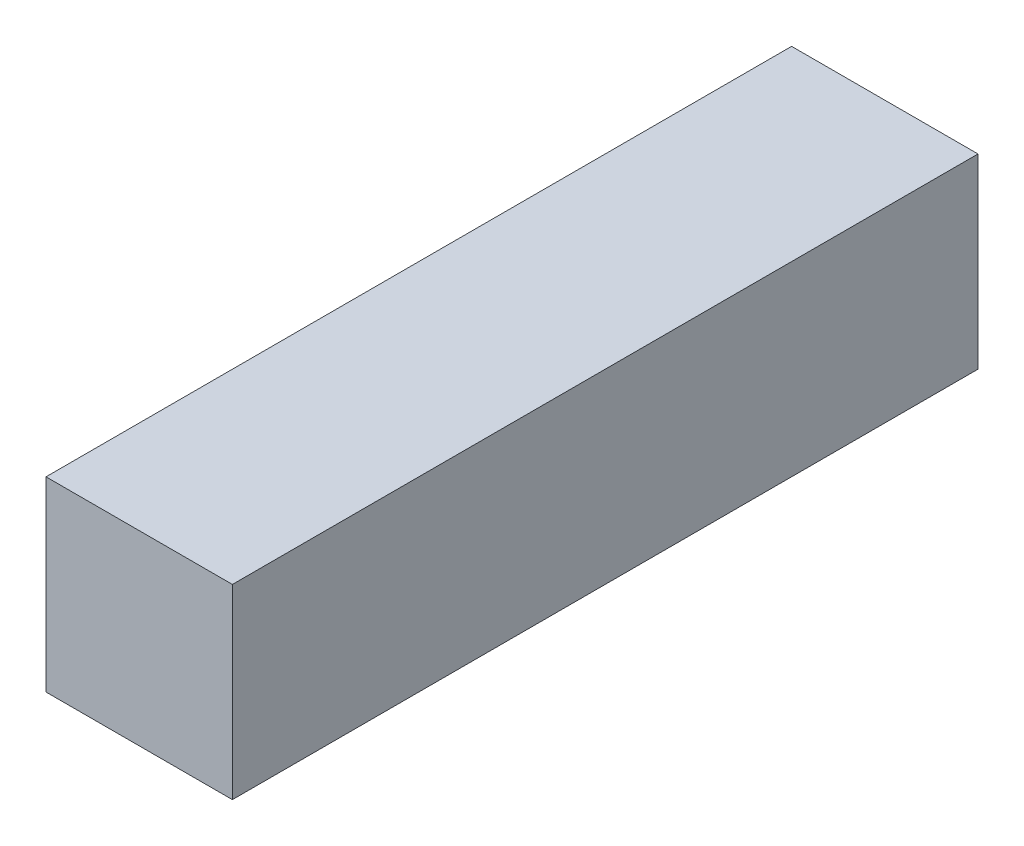
ISO-10303-21;
HEADER;
FILE_DESCRIPTION(('STEP AP214'),'2;1');
FILE_NAME('part.step','',(''),(''),'','','');
FILE_SCHEMA(('AUTOMOTIVE_DESIGN { 1 0 10303 214 1 1 1 1 }'));
ENDSEC;
DATA;
#1=APPLICATION_CONTEXT('core data for automotive mechanical design processes');
#2=APPLICATION_PROTOCOL_DEFINITION('international standard','automotive_design',2000,#1);
#3=PRODUCT_CONTEXT('',#1,'mechanical');
#4=PRODUCT('Part','Part','',(#3));
#5=PRODUCT_RELATED_PRODUCT_CATEGORY('part','',(#4));
#6=PRODUCT_DEFINITION_FORMATION('','',#4);
#7=PRODUCT_DEFINITION_CONTEXT('part definition',#1,'design');
#8=PRODUCT_DEFINITION('design','',#6,#7);
#9=PRODUCT_DEFINITION_SHAPE('','',#8);
#10=(LENGTH_UNIT() NAMED_UNIT(*) SI_UNIT(.MILLI.,.METRE.));
#11=(NAMED_UNIT(*) PLANE_ANGLE_UNIT() SI_UNIT($,.RADIAN.));
#12=(NAMED_UNIT(*) SI_UNIT($,.STERADIAN.) SOLID_ANGLE_UNIT());
#13=UNCERTAINTY_MEASURE_WITH_UNIT(LENGTH_MEASURE(1.E-05),#10,'distance_accuracy_value','');
#14=(GEOMETRIC_REPRESENTATION_CONTEXT(3) GLOBAL_UNCERTAINTY_ASSIGNED_CONTEXT((#13)) GLOBAL_UNIT_ASSIGNED_CONTEXT((#10,
#11,#12)) REPRESENTATION_CONTEXT('',''));
#15=CARTESIAN_POINT('',(0.,0.,0.));
#16=DIRECTION('',(0.,0.,1.));
#17=DIRECTION('',(1.,0.,0.));
#18=AXIS2_PLACEMENT_3D('',#15,#16,#17);
#19=CARTESIAN_POINT('',(-2.75,2.75,22.));
#20=DIRECTION('',(1.,0.,0.));
#21=DIRECTION('',(0.,1.,0.));
#22=AXIS2_PLACEMENT_3D('',#19,#20,#21);
#23=PLANE('',#22);
#24=DIRECTION('',(0.,-1.,0.));
#25=VECTOR('',#24,1.);
#26=CARTESIAN_POINT('',(-2.75,2.75,0.));
#27=LINE('',#26,#25);
#28=CARTESIAN_POINT('',(-2.75,2.75,0.));
#29=VERTEX_POINT('',#28);
#30=CARTESIAN_POINT('',(-2.75,-2.75,0.));
#31=VERTEX_POINT('',#30);
#32=EDGE_CURVE('E96',#29,#31,#27,.T.);
#33=ORIENTED_EDGE('',*,*,#32,.T.);
#34=DIRECTION('',(0.,0.,-1.));
#35=VECTOR('',#34,1.);
#36=CARTESIAN_POINT('',(-2.75,-2.75,22.));
#37=LINE('',#36,#35);
#38=CARTESIAN_POINT('',(-2.75,-2.75,22.));
#39=VERTEX_POINT('',#38);
#40=EDGE_CURVE('E11',#39,#31,#37,.T.);
#41=ORIENTED_EDGE('',*,*,#40,.F.);
#42=DIRECTION('',(0.,-1.,0.));
#43=VECTOR('',#42,1.);
#44=CARTESIAN_POINT('',(-2.75,2.75,22.));
#45=LINE('',#44,#43);
#46=CARTESIAN_POINT('',(-2.75,2.75,22.));
#47=VERTEX_POINT('',#46);
#48=EDGE_CURVE('E84',#47,#39,#45,.T.);
#49=ORIENTED_EDGE('',*,*,#48,.F.);
#50=DIRECTION('',(0.,0.,-1.));
#51=VECTOR('',#50,1.);
#52=CARTESIAN_POINT('',(-2.75,2.75,22.));
#53=LINE('',#52,#51);
#54=EDGE_CURVE('E92',#47,#29,#53,.T.);
#55=ORIENTED_EDGE('',*,*,#54,.T.);
#56=EDGE_LOOP('',(#33,#41,#49,#55));
#57=FACE_BOUND('',#56,.T.);
#58=ADVANCED_FACE('F33',(#57),#23,.F.);
#59=CARTESIAN_POINT('',(2.75,-2.75,22.));
#60=DIRECTION('',(0.,1.,0.));
#61=DIRECTION('',(-1.,0.,0.));
#62=AXIS2_PLACEMENT_3D('',#59,#60,#61);
#63=PLANE('',#62);
#64=DIRECTION('',(1.,0.,0.));
#65=VECTOR('',#64,1.);
#66=CARTESIAN_POINT('',(2.75,-2.75,0.));
#67=LINE('',#66,#65);
#68=CARTESIAN_POINT('',(2.75,-2.75,0.));
#69=VERTEX_POINT('',#68);
#70=EDGE_CURVE('E88',#31,#69,#67,.T.);
#71=ORIENTED_EDGE('',*,*,#70,.T.);
#72=DIRECTION('',(0.,0.,-1.));
#73=VECTOR('',#72,1.);
#74=CARTESIAN_POINT('',(2.75,-2.75,22.));
#75=LINE('',#74,#73);
#76=CARTESIAN_POINT('',(2.75,-2.75,22.));
#77=VERTEX_POINT('',#76);
#78=EDGE_CURVE('E41',#77,#69,#75,.T.);
#79=ORIENTED_EDGE('',*,*,#78,.F.);
#80=DIRECTION('',(1.,0.,0.));
#81=VECTOR('',#80,1.);
#82=CARTESIAN_POINT('',(2.75,-2.75,22.));
#83=LINE('',#82,#81);
#84=EDGE_CURVE('E79',#39,#77,#83,.T.);
#85=ORIENTED_EDGE('',*,*,#84,.F.);
#86=ORIENTED_EDGE('',*,*,#40,.T.);
#87=EDGE_LOOP('',(#71,#79,#85,#86));
#88=FACE_BOUND('',#87,.T.);
#89=ADVANCED_FACE('F87',(#88),#63,.F.);
#90=CARTESIAN_POINT('',(2.75,2.75,22.));
#91=DIRECTION('',(-1.,0.,0.));
#92=DIRECTION('',(0.,-1.,0.));
#93=AXIS2_PLACEMENT_3D('',#90,#91,#92);
#94=PLANE('',#93);
#95=DIRECTION('',(0.,1.,0.));
#96=VECTOR('',#95,1.);
#97=CARTESIAN_POINT('',(2.75,2.75,0.));
#98=LINE('',#97,#96);
#99=CARTESIAN_POINT('',(2.75,2.75,0.));
#100=VERTEX_POINT('',#99);
#101=EDGE_CURVE('E66',#69,#100,#98,.T.);
#102=ORIENTED_EDGE('',*,*,#101,.T.);
#103=DIRECTION('',(0.,0.,-1.));
#104=VECTOR('',#103,1.);
#105=CARTESIAN_POINT('',(2.75,2.75,22.));
#106=LINE('',#105,#104);
#107=CARTESIAN_POINT('',(2.75,2.75,22.));
#108=VERTEX_POINT('',#107);
#109=EDGE_CURVE('E89',#108,#100,#106,.T.);
#110=ORIENTED_EDGE('',*,*,#109,.F.);
#111=DIRECTION('',(0.,1.,0.));
#112=VECTOR('',#111,1.);
#113=CARTESIAN_POINT('',(2.75,2.75,22.));
#114=LINE('',#113,#112);
#115=EDGE_CURVE('E82',#77,#108,#114,.T.);
#116=ORIENTED_EDGE('',*,*,#115,.F.);
#117=ORIENTED_EDGE('',*,*,#78,.T.);
#118=EDGE_LOOP('',(#102,#110,#116,#117));
#119=FACE_BOUND('',#118,.T.);
#120=ADVANCED_FACE('F90',(#119),#94,.F.);
#121=CARTESIAN_POINT('',(2.75,2.75,22.));
#122=DIRECTION('',(0.,-1.,0.));
#123=DIRECTION('',(1.,0.,0.));
#124=AXIS2_PLACEMENT_3D('',#121,#122,#123);
#125=PLANE('',#124);
#126=DIRECTION('',(-1.,0.,0.));
#127=VECTOR('',#126,1.);
#128=CARTESIAN_POINT('',(2.75,2.75,0.));
#129=LINE('',#128,#127);
#130=EDGE_CURVE('E72',#100,#29,#129,.T.);
#131=ORIENTED_EDGE('',*,*,#130,.T.);
#132=ORIENTED_EDGE('',*,*,#54,.F.);
#133=DIRECTION('',(-1.,0.,0.));
#134=VECTOR('',#133,1.);
#135=CARTESIAN_POINT('',(2.75,2.75,22.));
#136=LINE('',#135,#134);
#137=EDGE_CURVE('E49',#108,#47,#136,.T.);
#138=ORIENTED_EDGE('',*,*,#137,.F.);
#139=ORIENTED_EDGE('',*,*,#109,.T.);
#140=EDGE_LOOP('',(#131,#132,#138,#139));
#141=FACE_BOUND('',#140,.T.);
#142=ADVANCED_FACE('F103',(#141),#125,.F.);
#143=CARTESIAN_POINT('',(0.,0.,22.));
#144=DIRECTION('',(0.,0.,-1.));
#145=DIRECTION('',(-1.,0.,0.));
#146=AXIS2_PLACEMENT_3D('',#143,#144,#145);
#147=PLANE('',#146);
#148=ORIENTED_EDGE('',*,*,#48,.T.);
#149=ORIENTED_EDGE('',*,*,#84,.T.);
#150=ORIENTED_EDGE('',*,*,#115,.T.);
#151=ORIENTED_EDGE('',*,*,#137,.T.);
#152=EDGE_LOOP('',(#148,#149,#150,#151));
#153=FACE_BOUND('',#152,.T.);
#154=ADVANCED_FACE('F80',(#153),#147,.F.);
#155=CARTESIAN_POINT('',(0.,0.,0.));
#156=DIRECTION('',(0.,0.,-1.));
#157=DIRECTION('',(-1.,0.,0.));
#158=AXIS2_PLACEMENT_3D('',#155,#156,#157);
#159=PLANE('',#158);
#160=ORIENTED_EDGE('',*,*,#32,.F.);
#161=ORIENTED_EDGE('',*,*,#130,.F.);
#162=ORIENTED_EDGE('',*,*,#101,.F.);
#163=ORIENTED_EDGE('',*,*,#70,.F.);
#164=EDGE_LOOP('',(#160,#161,#162,#163));
#165=FACE_BOUND('',#164,.T.);
#166=ADVANCED_FACE('F106',(#165),#159,.T.);
#167=CLOSED_SHELL('',(#58,#89,#120,#142,#154,#166));
#168=MANIFOLD_SOLID_BREP('B2',#167);
#169=ADVANCED_BREP_SHAPE_REPRESENTATION('',(#18,#168),#14);
#170=SHAPE_DEFINITION_REPRESENTATION(#9,#169);
ENDSEC;
END-ISO-10303-21;
